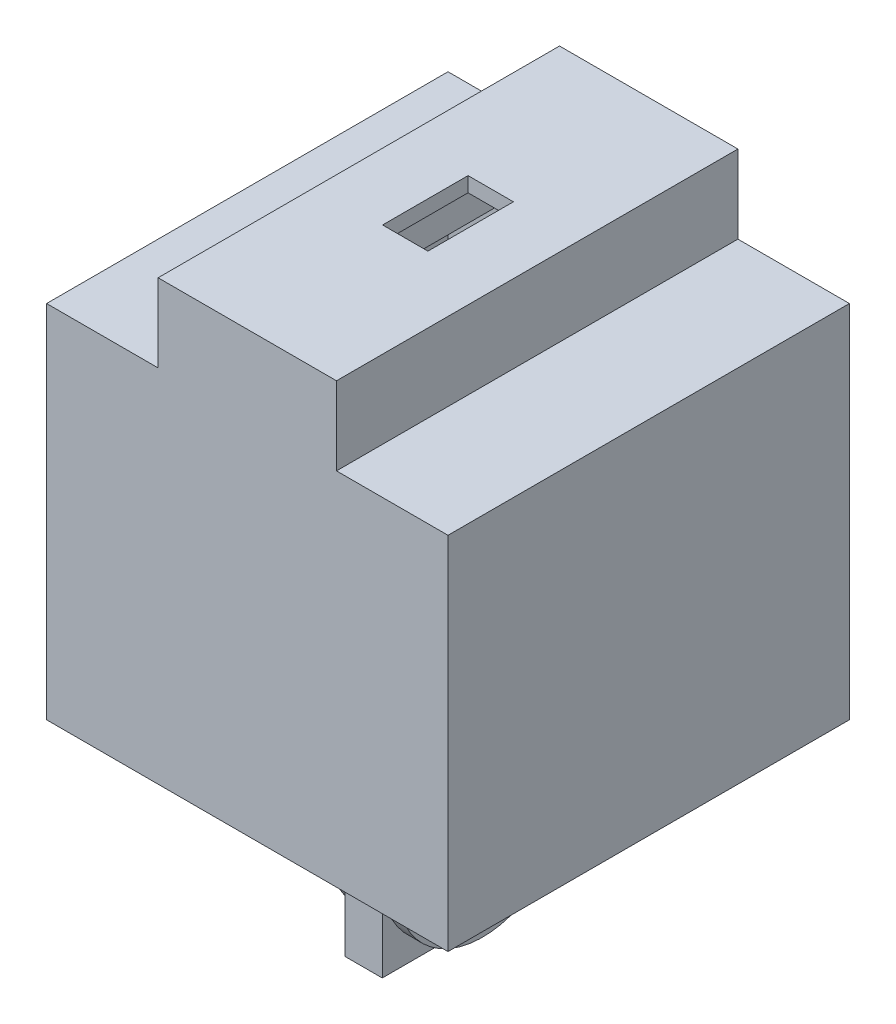
ISO-10303-21;
HEADER;
FILE_DESCRIPTION(('STEP AP214'),'2;1');
FILE_NAME('part.step','',(''),(''),'','','');
FILE_SCHEMA(('AUTOMOTIVE_DESIGN { 1 0 10303 214 1 1 1 1 }'));
ENDSEC;
DATA;
#1=APPLICATION_CONTEXT('core data for automotive mechanical design processes');
#2=APPLICATION_PROTOCOL_DEFINITION('international standard','automotive_design',2000,#1);
#3=PRODUCT_CONTEXT('',#1,'mechanical');
#4=PRODUCT('Part','Part','',(#3));
#5=PRODUCT_RELATED_PRODUCT_CATEGORY('part','',(#4));
#6=PRODUCT_DEFINITION_FORMATION('','',#4);
#7=PRODUCT_DEFINITION_CONTEXT('part definition',#1,'design');
#8=PRODUCT_DEFINITION('design','',#6,#7);
#9=PRODUCT_DEFINITION_SHAPE('','',#8);
#10=(LENGTH_UNIT() NAMED_UNIT(*) SI_UNIT(.MILLI.,.METRE.));
#11=(NAMED_UNIT(*) PLANE_ANGLE_UNIT() SI_UNIT($,.RADIAN.));
#12=(NAMED_UNIT(*) SI_UNIT($,.STERADIAN.) SOLID_ANGLE_UNIT());
#13=UNCERTAINTY_MEASURE_WITH_UNIT(LENGTH_MEASURE(1.E-05),#10,'distance_accuracy_value','');
#14=(GEOMETRIC_REPRESENTATION_CONTEXT(3) GLOBAL_UNCERTAINTY_ASSIGNED_CONTEXT((#13)) GLOBAL_UNIT_ASSIGNED_CONTEXT((#10,
#11,#12)) REPRESENTATION_CONTEXT('',''));
#15=CARTESIAN_POINT('',(0.,0.,0.));
#16=DIRECTION('',(0.,0.,1.));
#17=DIRECTION('',(1.,0.,0.));
#18=AXIS2_PLACEMENT_3D('',#15,#16,#17);
#19=CARTESIAN_POINT('',(45.3139287517532,-50.,72.9978574814878));
#20=DIRECTION('',(1.,0.,0.));
#21=DIRECTION('',(0.,0.,-1.));
#22=AXIS2_PLACEMENT_3D('',#19,#20,#21);
#23=PLANE('',#22);
#24=CARTESIAN_POINT('',(45.3139287517532,-27.,50.));
#25=DIRECTION('',(-1.,0.,0.));
#26=DIRECTION('',(0.,0.,1.));
#27=AXIS2_PLACEMENT_3D('',#24,#25,#26);
#28=CIRCLE('',#27,22.9978574814878);
#29=CARTESIAN_POINT('',(45.3139287517532,-27.,27.0021425185122));
#30=VERTEX_POINT('',#29);
#31=CARTESIAN_POINT('',(45.3139287517532,-27.,72.9978574814878));
#32=VERTEX_POINT('',#31);
#33=EDGE_CURVE('E291',#30,#32,#28,.T.);
#34=ORIENTED_EDGE('',*,*,#33,.F.);
#35=DIRECTION('',(0.,1.,0.));
#36=VECTOR('',#35,1.);
#37=CARTESIAN_POINT('',(45.3139287517532,-50.,27.0021425185122));
#38=LINE('',#37,#36);
#39=CARTESIAN_POINT('',(45.3139287517532,-50.,27.0021425185122));
#40=VERTEX_POINT('',#39);
#41=EDGE_CURVE('E272',#40,#30,#38,.T.);
#42=ORIENTED_EDGE('',*,*,#41,.F.);
#43=DIRECTION('',(0.,0.,-1.));
#44=VECTOR('',#43,1.);
#45=CARTESIAN_POINT('',(45.3139287517532,-50.,72.9978574814878));
#46=LINE('',#45,#44);
#47=CARTESIAN_POINT('',(45.3139287517532,-50.,72.9978574814878));
#48=VERTEX_POINT('',#47);
#49=EDGE_CURVE('E313',#48,#40,#46,.T.);
#50=ORIENTED_EDGE('',*,*,#49,.F.);
#51=DIRECTION('',(0.,1.,0.));
#52=VECTOR('',#51,1.);
#53=CARTESIAN_POINT('',(45.3139287517532,-50.,72.9978574814878));
#54=LINE('',#53,#52);
#55=EDGE_CURVE('E293',#48,#32,#54,.T.);
#56=ORIENTED_EDGE('',*,*,#55,.T.);
#57=EDGE_LOOP('',(#34,#42,#50,#56));
#58=FACE_BOUND('',#57,.T.);
#59=ADVANCED_FACE('F98',(#58),#23,.F.);
#60=CARTESIAN_POINT('',(55.3139287517532,-50.,72.9978574814878));
#61=DIRECTION('',(-1.,0.,0.));
#62=DIRECTION('',(0.,0.,1.));
#63=AXIS2_PLACEMENT_3D('',#60,#61,#62);
#64=PLANE('',#63);
#65=CARTESIAN_POINT('',(55.3139287517532,-27.,50.));
#66=DIRECTION('',(1.,0.,0.));
#67=DIRECTION('',(0.,0.,-1.));
#68=AXIS2_PLACEMENT_3D('',#65,#66,#67);
#69=CIRCLE('',#68,22.9978574814878);
#70=CARTESIAN_POINT('',(55.3139287517532,-27.,72.9978574814878));
#71=VERTEX_POINT('',#70);
#72=CARTESIAN_POINT('',(55.3139287517532,-27.,27.0021425185122));
#73=VERTEX_POINT('',#72);
#74=EDGE_CURVE('E299',#71,#73,#69,.T.);
#75=ORIENTED_EDGE('',*,*,#74,.F.);
#76=DIRECTION('',(0.,1.,0.));
#77=VECTOR('',#76,1.);
#78=CARTESIAN_POINT('',(55.3139287517532,-50.,72.9978574814878));
#79=LINE('',#78,#77);
#80=CARTESIAN_POINT('',(55.3139287517532,-50.,72.9978574814878));
#81=VERTEX_POINT('',#80);
#82=EDGE_CURVE('E328',#81,#71,#79,.T.);
#83=ORIENTED_EDGE('',*,*,#82,.F.);
#84=DIRECTION('',(0.,0.,1.));
#85=VECTOR('',#84,1.);
#86=CARTESIAN_POINT('',(55.3139287517532,-50.,72.9978574814878));
#87=LINE('',#86,#85);
#88=CARTESIAN_POINT('',(55.3139287517532,-50.,27.0021425185122));
#89=VERTEX_POINT('',#88);
#90=EDGE_CURVE('E307',#89,#81,#87,.T.);
#91=ORIENTED_EDGE('',*,*,#90,.F.);
#92=DIRECTION('',(0.,1.,0.));
#93=VECTOR('',#92,1.);
#94=CARTESIAN_POINT('',(55.3139287517532,-50.,27.0021425185122));
#95=LINE('',#94,#93);
#96=EDGE_CURVE('E288',#89,#73,#95,.T.);
#97=ORIENTED_EDGE('',*,*,#96,.T.);
#98=EDGE_LOOP('',(#75,#83,#91,#97));
#99=FACE_BOUND('',#98,.T.);
#100=ADVANCED_FACE('F538',(#99),#64,.F.);
#101=CARTESIAN_POINT('',(104.,-4.,100.));
#102=DIRECTION('',(0.,1.,0.));
#103=DIRECTION('',(0.,0.,1.));
#104=AXIS2_PLACEMENT_3D('',#101,#102,#103);
#105=PLANE('',#104);
#106=DIRECTION('',(0.,0.,-1.));
#107=VECTOR('',#106,1.);
#108=CARTESIAN_POINT('',(-4.,-4.,100.));
#109=LINE('',#108,#107);
#110=CARTESIAN_POINT('',(-4.,-4.,104.));
#111=VERTEX_POINT('',#110);
#112=CARTESIAN_POINT('',(-4.,-4.,-4.));
#113=VERTEX_POINT('',#112);
#114=EDGE_CURVE('E106',#111,#113,#109,.T.);
#115=ORIENTED_EDGE('',*,*,#114,.T.);
#116=DIRECTION('',(1.,0.,0.));
#117=VECTOR('',#116,1.);
#118=CARTESIAN_POINT('',(-4.,-4.,-4.));
#119=LINE('',#118,#117);
#120=CARTESIAN_POINT('',(104.,-4.,-4.));
#121=VERTEX_POINT('',#120);
#122=EDGE_CURVE('E368',#113,#121,#119,.T.);
#123=ORIENTED_EDGE('',*,*,#122,.T.);
#124=DIRECTION('',(0.,0.,-1.));
#125=VECTOR('',#124,1.);
#126=CARTESIAN_POINT('',(104.,-4.,100.));
#127=LINE('',#126,#125);
#128=CARTESIAN_POINT('',(104.,-4.,104.));
#129=VERTEX_POINT('',#128);
#130=EDGE_CURVE('E12',#129,#121,#127,.T.);
#131=ORIENTED_EDGE('',*,*,#130,.F.);
#132=DIRECTION('',(1.,0.,0.));
#133=VECTOR('',#132,1.);
#134=CARTESIAN_POINT('',(-4.,-4.,104.));
#135=LINE('',#134,#133);
#136=EDGE_CURVE('E392',#111,#129,#135,.T.);
#137=ORIENTED_EDGE('',*,*,#136,.F.);
#138=EDGE_LOOP('',(#115,#123,#131,#137));
#139=FACE_BOUND('',#138,.T.);
#140=DIRECTION('',(0.,0.,1.));
#141=VECTOR('',#140,1.);
#142=CARTESIAN_POINT('',(55.3139287517532,-4.,72.9978574814878));
#143=LINE('',#142,#141);
#144=CARTESIAN_POINT('',(55.3139287517532,-4.,27.0021425185122));
#145=VERTEX_POINT('',#144);
#146=CARTESIAN_POINT('',(55.3139287517532,-4.,72.9978574814878));
#147=VERTEX_POINT('',#146);
#148=EDGE_CURVE('E305',#145,#147,#143,.T.);
#149=ORIENTED_EDGE('',*,*,#148,.F.);
#150=DIRECTION('',(1.,0.,0.));
#151=VECTOR('',#150,1.);
#152=CARTESIAN_POINT('',(45.3139287517532,-4.,27.0021425185122));
#153=LINE('',#152,#151);
#154=CARTESIAN_POINT('',(45.3139287517532,-4.,27.0021425185122));
#155=VERTEX_POINT('',#154);
#156=EDGE_CURVE('E311',#155,#145,#153,.T.);
#157=ORIENTED_EDGE('',*,*,#156,.F.);
#158=DIRECTION('',(0.,0.,-1.));
#159=VECTOR('',#158,1.);
#160=CARTESIAN_POINT('',(45.3139287517532,-4.,72.9978574814878));
#161=LINE('',#160,#159);
#162=CARTESIAN_POINT('',(45.3139287517532,-4.,72.9978574814878));
#163=VERTEX_POINT('',#162);
#164=EDGE_CURVE('E287',#163,#155,#161,.T.);
#165=ORIENTED_EDGE('',*,*,#164,.F.);
#166=DIRECTION('',(-1.,0.,0.));
#167=VECTOR('',#166,1.);
#168=CARTESIAN_POINT('',(45.3139287517532,-4.,72.9978574814878));
#169=LINE('',#168,#167);
#170=EDGE_CURVE('E319',#147,#163,#169,.T.);
#171=ORIENTED_EDGE('',*,*,#170,.F.);
#172=EDGE_LOOP('',(#149,#157,#165,#171));
#173=FACE_BOUND('',#172,.T.);
#174=ADVANCED_FACE('F100',(#139,#173),#105,.F.);
#175=CARTESIAN_POINT('',(104.,114.,100.));
#176=DIRECTION('',(-1.,0.,0.));
#177=DIRECTION('',(0.,0.,1.));
#178=AXIS2_PLACEMENT_3D('',#175,#176,#177);
#179=PLANE('',#178);
#180=DIRECTION('',(0.,0.,1.));
#181=VECTOR('',#180,1.);
#182=CARTESIAN_POINT('',(104.,93.,0.));
#183=LINE('',#182,#181);
#184=CARTESIAN_POINT('',(104.,93.,-4.));
#185=VERTEX_POINT('',#184);
#186=CARTESIAN_POINT('',(104.,93.,104.));
#187=VERTEX_POINT('',#186);
#188=EDGE_CURVE('E411',#185,#187,#183,.T.);
#189=ORIENTED_EDGE('',*,*,#188,.T.);
#190=DIRECTION('',(0.,1.,0.));
#191=VECTOR('',#190,1.);
#192=CARTESIAN_POINT('',(104.,-4.,104.));
#193=LINE('',#192,#191);
#194=EDGE_CURVE('E395',#129,#187,#193,.T.);
#195=ORIENTED_EDGE('',*,*,#194,.F.);
#196=ORIENTED_EDGE('',*,*,#130,.T.);
#197=DIRECTION('',(0.,1.,0.));
#198=VECTOR('',#197,1.);
#199=CARTESIAN_POINT('',(104.,-4.,-4.));
#200=LINE('',#199,#198);
#201=EDGE_CURVE('E371',#121,#185,#200,.T.);
#202=ORIENTED_EDGE('',*,*,#201,.T.);
#203=EDGE_LOOP('',(#189,#195,#196,#202));
#204=FACE_BOUND('',#203,.T.);
#205=ADVANCED_FACE('F520',(#204),#179,.F.);
#206=CARTESIAN_POINT('',(-4.,114.,100.));
#207=DIRECTION('',(0.,-1.,0.));
#208=DIRECTION('',(0.,0.,-1.));
#209=AXIS2_PLACEMENT_3D('',#206,#207,#208);
#210=PLANE('',#209);
#211=DIRECTION('',(0.,0.,1.));
#212=VECTOR('',#211,1.);
#213=CARTESIAN_POINT('',(43.9,114.,0.));
#214=LINE('',#213,#212);
#215=CARTESIAN_POINT('',(43.9,114.,38.5));
#216=VERTEX_POINT('',#215);
#217=CARTESIAN_POINT('',(43.9,114.,61.5));
#218=VERTEX_POINT('',#217);
#219=EDGE_CURVE('E346',#216,#218,#214,.T.);
#220=ORIENTED_EDGE('',*,*,#219,.F.);
#221=DIRECTION('',(-1.,0.,0.));
#222=VECTOR('',#221,1.);
#223=CARTESIAN_POINT('',(0.,114.,38.5));
#224=LINE('',#223,#222);
#225=CARTESIAN_POINT('',(56.1,114.,38.5));
#226=VERTEX_POINT('',#225);
#227=EDGE_CURVE('E330',#226,#216,#224,.T.);
#228=ORIENTED_EDGE('',*,*,#227,.F.);
#229=DIRECTION('',(0.,0.,-1.));
#230=VECTOR('',#229,1.);
#231=CARTESIAN_POINT('',(56.1,114.,0.));
#232=LINE('',#231,#230);
#233=CARTESIAN_POINT('',(56.1,114.,61.5));
#234=VERTEX_POINT('',#233);
#235=EDGE_CURVE('E335',#234,#226,#232,.T.);
#236=ORIENTED_EDGE('',*,*,#235,.F.);
#237=DIRECTION('',(1.,0.,0.));
#238=VECTOR('',#237,1.);
#239=CARTESIAN_POINT('',(0.,114.,61.5));
#240=LINE('',#239,#238);
#241=EDGE_CURVE('E349',#218,#234,#240,.T.);
#242=ORIENTED_EDGE('',*,*,#241,.F.);
#243=EDGE_LOOP('',(#220,#228,#236,#242));
#244=FACE_BOUND('',#243,.T.);
#245=DIRECTION('',(0.,0.,1.));
#246=VECTOR('',#245,1.);
#247=CARTESIAN_POINT('',(74.,114.,0.));
#248=LINE('',#247,#246);
#249=CARTESIAN_POINT('',(74.,114.,-4.));
#250=VERTEX_POINT('',#249);
#251=CARTESIAN_POINT('',(74.,114.,104.));
#252=VERTEX_POINT('',#251);
#253=EDGE_CURVE('E410',#250,#252,#248,.T.);
#254=ORIENTED_EDGE('',*,*,#253,.F.);
#255=DIRECTION('',(-1.,0.,0.));
#256=VECTOR('',#255,1.);
#257=CARTESIAN_POINT('',(74.,114.,-4.));
#258=LINE('',#257,#256);
#259=CARTESIAN_POINT('',(26.,114.,-4.));
#260=VERTEX_POINT('',#259);
#261=EDGE_CURVE('E380',#250,#260,#258,.T.);
#262=ORIENTED_EDGE('',*,*,#261,.T.);
#263=DIRECTION('',(0.,0.,1.));
#264=VECTOR('',#263,1.);
#265=CARTESIAN_POINT('',(26.,114.,0.));
#266=LINE('',#265,#264);
#267=CARTESIAN_POINT('',(26.,114.,104.));
#268=VERTEX_POINT('',#267);
#269=EDGE_CURVE('E461',#260,#268,#266,.T.);
#270=ORIENTED_EDGE('',*,*,#269,.T.);
#271=DIRECTION('',(-1.,0.,0.));
#272=VECTOR('',#271,1.);
#273=CARTESIAN_POINT('',(74.,114.,104.));
#274=LINE('',#273,#272);
#275=EDGE_CURVE('E404',#252,#268,#274,.T.);
#276=ORIENTED_EDGE('',*,*,#275,.F.);
#277=EDGE_LOOP('',(#254,#262,#270,#276));
#278=FACE_BOUND('',#277,.T.);
#279=ADVANCED_FACE('F513',(#244,#278),#210,.F.);
#280=CARTESIAN_POINT('',(-4.,-4.,100.));
#281=DIRECTION('',(1.,0.,0.));
#282=DIRECTION('',(0.,0.,-1.));
#283=AXIS2_PLACEMENT_3D('',#280,#281,#282);
#284=PLANE('',#283);
#285=ORIENTED_EDGE('',*,*,#114,.F.);
#286=DIRECTION('',(0.,-1.,0.));
#287=VECTOR('',#286,1.);
#288=CARTESIAN_POINT('',(-4.,93.,104.));
#289=LINE('',#288,#287);
#290=CARTESIAN_POINT('',(-4.,93.,104.));
#291=VERTEX_POINT('',#290);
#292=EDGE_CURVE('E389',#291,#111,#289,.T.);
#293=ORIENTED_EDGE('',*,*,#292,.F.);
#294=DIRECTION('',(0.,0.,1.));
#295=VECTOR('',#294,1.);
#296=CARTESIAN_POINT('',(-4.,93.,0.));
#297=LINE('',#296,#295);
#298=CARTESIAN_POINT('',(-4.,93.,-4.));
#299=VERTEX_POINT('',#298);
#300=EDGE_CURVE('E459',#299,#291,#297,.T.);
#301=ORIENTED_EDGE('',*,*,#300,.F.);
#302=DIRECTION('',(0.,-1.,0.));
#303=VECTOR('',#302,1.);
#304=CARTESIAN_POINT('',(-4.,93.,-4.));
#305=LINE('',#304,#303);
#306=EDGE_CURVE('E365',#299,#113,#305,.T.);
#307=ORIENTED_EDGE('',*,*,#306,.T.);
#308=EDGE_LOOP('',(#285,#293,#301,#307));
#309=FACE_BOUND('',#308,.T.);
#310=ADVANCED_FACE('F504',(#309),#284,.F.);
#311=CARTESIAN_POINT('',(-4.,93.,0.));
#312=DIRECTION('',(0.,-1.,0.));
#313=DIRECTION('',(0.,0.,-1.));
#314=AXIS2_PLACEMENT_3D('',#311,#312,#313);
#315=PLANE('',#314);
#316=ORIENTED_EDGE('',*,*,#300,.T.);
#317=DIRECTION('',(-1.,0.,0.));
#318=VECTOR('',#317,1.);
#319=CARTESIAN_POINT('',(0.,93.,104.));
#320=LINE('',#319,#318);
#321=CARTESIAN_POINT('',(26.,93.,104.));
#322=VERTEX_POINT('',#321);
#323=EDGE_CURVE('E386',#322,#291,#320,.T.);
#324=ORIENTED_EDGE('',*,*,#323,.F.);
#325=DIRECTION('',(0.,0.,1.));
#326=VECTOR('',#325,1.);
#327=CARTESIAN_POINT('',(26.,93.,0.));
#328=LINE('',#327,#326);
#329=CARTESIAN_POINT('',(26.,93.,-4.));
#330=VERTEX_POINT('',#329);
#331=EDGE_CURVE('E457',#330,#322,#328,.T.);
#332=ORIENTED_EDGE('',*,*,#331,.F.);
#333=DIRECTION('',(-1.,0.,0.));
#334=VECTOR('',#333,1.);
#335=CARTESIAN_POINT('',(0.,93.,-4.));
#336=LINE('',#335,#334);
#337=EDGE_CURVE('E356',#330,#299,#336,.T.);
#338=ORIENTED_EDGE('',*,*,#337,.T.);
#339=EDGE_LOOP('',(#316,#324,#332,#338));
#340=FACE_BOUND('',#339,.T.);
#341=ADVANCED_FACE('F507',(#340),#315,.F.);
#342=CARTESIAN_POINT('',(26.,93.,0.));
#343=DIRECTION('',(1.,0.,0.));
#344=DIRECTION('',(0.,1.,0.));
#345=AXIS2_PLACEMENT_3D('',#342,#343,#344);
#346=PLANE('',#345);
#347=ORIENTED_EDGE('',*,*,#269,.F.);
#348=DIRECTION('',(0.,-1.,0.));
#349=VECTOR('',#348,1.);
#350=CARTESIAN_POINT('',(26.,114.,-4.));
#351=LINE('',#350,#349);
#352=EDGE_CURVE('E383',#260,#330,#351,.T.);
#353=ORIENTED_EDGE('',*,*,#352,.T.);
#354=ORIENTED_EDGE('',*,*,#331,.T.);
#355=DIRECTION('',(0.,-1.,0.));
#356=VECTOR('',#355,1.);
#357=CARTESIAN_POINT('',(26.,114.,104.));
#358=LINE('',#357,#356);
#359=EDGE_CURVE('E407',#268,#322,#358,.T.);
#360=ORIENTED_EDGE('',*,*,#359,.F.);
#361=EDGE_LOOP('',(#347,#353,#354,#360));
#362=FACE_BOUND('',#361,.T.);
#363=ADVANCED_FACE('F526',(#362),#346,.F.);
#364=CARTESIAN_POINT('',(74.,110.,0.));
#365=DIRECTION('',(1.,0.,0.));
#366=DIRECTION('',(0.,0.,-1.));
#367=AXIS2_PLACEMENT_3D('',#364,#365,#366);
#368=PLANE('',#367);
#369=DIRECTION('',(0.,0.,1.));
#370=VECTOR('',#369,1.);
#371=CARTESIAN_POINT('',(74.,93.,0.));
#372=LINE('',#371,#370);
#373=CARTESIAN_POINT('',(74.,93.,-4.));
#374=VERTEX_POINT('',#373);
#375=CARTESIAN_POINT('',(74.,93.,104.));
#376=VERTEX_POINT('',#375);
#377=EDGE_CURVE('E442',#374,#376,#372,.T.);
#378=ORIENTED_EDGE('',*,*,#377,.F.);
#379=DIRECTION('',(0.,1.,0.));
#380=VECTOR('',#379,1.);
#381=CARTESIAN_POINT('',(74.,93.,-4.));
#382=LINE('',#381,#380);
#383=EDGE_CURVE('E377',#374,#250,#382,.T.);
#384=ORIENTED_EDGE('',*,*,#383,.T.);
#385=ORIENTED_EDGE('',*,*,#253,.T.);
#386=DIRECTION('',(0.,1.,0.));
#387=VECTOR('',#386,1.);
#388=CARTESIAN_POINT('',(74.,93.,104.));
#389=LINE('',#388,#387);
#390=EDGE_CURVE('E401',#376,#252,#389,.T.);
#391=ORIENTED_EDGE('',*,*,#390,.F.);
#392=EDGE_LOOP('',(#378,#384,#385,#391));
#393=FACE_BOUND('',#392,.T.);
#394=ADVANCED_FACE('F517',(#393),#368,.T.);
#395=CARTESIAN_POINT('',(100.,93.,0.));
#396=DIRECTION('',(0.,1.,0.));
#397=DIRECTION('',(0.,0.,1.));
#398=AXIS2_PLACEMENT_3D('',#395,#396,#397);
#399=PLANE('',#398);
#400=ORIENTED_EDGE('',*,*,#377,.T.);
#401=DIRECTION('',(-1.,0.,0.));
#402=VECTOR('',#401,1.);
#403=CARTESIAN_POINT('',(100.,93.,104.));
#404=LINE('',#403,#402);
#405=EDGE_CURVE('E398',#187,#376,#404,.T.);
#406=ORIENTED_EDGE('',*,*,#405,.F.);
#407=ORIENTED_EDGE('',*,*,#188,.F.);
#408=DIRECTION('',(-1.,0.,0.));
#409=VECTOR('',#408,1.);
#410=CARTESIAN_POINT('',(100.,93.,-4.));
#411=LINE('',#410,#409);
#412=EDGE_CURVE('E374',#185,#374,#411,.T.);
#413=ORIENTED_EDGE('',*,*,#412,.T.);
#414=EDGE_LOOP('',(#400,#406,#407,#413));
#415=FACE_BOUND('',#414,.T.);
#416=ADVANCED_FACE('F533',(#415),#399,.T.);
#417=CARTESIAN_POINT('',(0.,0.,104.));
#418=DIRECTION('',(0.,0.,1.));
#419=DIRECTION('',(1.,0.,0.));
#420=AXIS2_PLACEMENT_3D('',#417,#418,#419);
#421=PLANE('',#420);
#422=ORIENTED_EDGE('',*,*,#323,.T.);
#423=ORIENTED_EDGE('',*,*,#292,.T.);
#424=ORIENTED_EDGE('',*,*,#136,.T.);
#425=ORIENTED_EDGE('',*,*,#194,.T.);
#426=ORIENTED_EDGE('',*,*,#405,.T.);
#427=ORIENTED_EDGE('',*,*,#390,.T.);
#428=ORIENTED_EDGE('',*,*,#275,.T.);
#429=ORIENTED_EDGE('',*,*,#359,.T.);
#430=EDGE_LOOP('',(#422,#423,#424,#425,#426,#427,#428,#429));
#431=FACE_BOUND('',#430,.T.);
#432=ADVANCED_FACE('F523',(#431),#421,.T.);
#433=CARTESIAN_POINT('',(0.,0.,-4.));
#434=DIRECTION('',(0.,0.,1.));
#435=DIRECTION('',(1.,0.,0.));
#436=AXIS2_PLACEMENT_3D('',#433,#434,#435);
#437=PLANE('',#436);
#438=ORIENTED_EDGE('',*,*,#337,.F.);
#439=ORIENTED_EDGE('',*,*,#352,.F.);
#440=ORIENTED_EDGE('',*,*,#261,.F.);
#441=ORIENTED_EDGE('',*,*,#383,.F.);
#442=ORIENTED_EDGE('',*,*,#412,.F.);
#443=ORIENTED_EDGE('',*,*,#201,.F.);
#444=ORIENTED_EDGE('',*,*,#122,.F.);
#445=ORIENTED_EDGE('',*,*,#306,.F.);
#446=EDGE_LOOP('',(#438,#439,#440,#441,#442,#443,#444,#445));
#447=FACE_BOUND('',#446,.T.);
#448=ADVANCED_FACE('F502',(#447),#437,.F.);
#449=CARTESIAN_POINT('',(0.,110.,38.5));
#450=DIRECTION('',(0.,0.,-1.));
#451=DIRECTION('',(-1.,0.,0.));
#452=AXIS2_PLACEMENT_3D('',#449,#450,#451);
#453=PLANE('',#452);
#454=ORIENTED_EDGE('',*,*,#227,.T.);
#455=DIRECTION('',(0.,1.,0.));
#456=VECTOR('',#455,1.);
#457=CARTESIAN_POINT('',(43.9,110.,38.5));
#458=LINE('',#457,#456);
#459=CARTESIAN_POINT('',(43.9,110.,38.5));
#460=VERTEX_POINT('',#459);
#461=EDGE_CURVE('E344',#460,#216,#458,.T.);
#462=ORIENTED_EDGE('',*,*,#461,.F.);
#463=DIRECTION('',(-1.,0.,0.));
#464=VECTOR('',#463,1.);
#465=CARTESIAN_POINT('',(0.,110.,38.5));
#466=LINE('',#465,#464);
#467=CARTESIAN_POINT('',(56.1,110.,38.5));
#468=VERTEX_POINT('',#467);
#469=EDGE_CURVE('E331',#468,#460,#466,.T.);
#470=ORIENTED_EDGE('',*,*,#469,.F.);
#471=DIRECTION('',(0.,1.,0.));
#472=VECTOR('',#471,1.);
#473=CARTESIAN_POINT('',(56.1,110.,38.5));
#474=LINE('',#473,#472);
#475=EDGE_CURVE('E354',#468,#226,#474,.T.);
#476=ORIENTED_EDGE('',*,*,#475,.T.);
#477=EDGE_LOOP('',(#454,#462,#470,#476));
#478=FACE_BOUND('',#477,.T.);
#479=ADVANCED_FACE('F565',(#478),#453,.F.);
#480=CARTESIAN_POINT('',(56.1,110.,0.));
#481=DIRECTION('',(1.,0.,0.));
#482=DIRECTION('',(0.,0.,-1.));
#483=AXIS2_PLACEMENT_3D('',#480,#481,#482);
#484=PLANE('',#483);
#485=ORIENTED_EDGE('',*,*,#235,.T.);
#486=ORIENTED_EDGE('',*,*,#475,.F.);
#487=DIRECTION('',(0.,0.,-1.));
#488=VECTOR('',#487,1.);
#489=CARTESIAN_POINT('',(56.1,110.,0.));
#490=LINE('',#489,#488);
#491=CARTESIAN_POINT('',(56.1,110.,61.5));
#492=VERTEX_POINT('',#491);
#493=EDGE_CURVE('E341',#492,#468,#490,.T.);
#494=ORIENTED_EDGE('',*,*,#493,.F.);
#495=DIRECTION('',(0.,1.,0.));
#496=VECTOR('',#495,1.);
#497=CARTESIAN_POINT('',(56.1,110.,61.5));
#498=LINE('',#497,#496);
#499=EDGE_CURVE('E357',#492,#234,#498,.T.);
#500=ORIENTED_EDGE('',*,*,#499,.T.);
#501=EDGE_LOOP('',(#485,#486,#494,#500));
#502=FACE_BOUND('',#501,.T.);
#503=ADVANCED_FACE('F561',(#502),#484,.F.);
#504=CARTESIAN_POINT('',(0.,110.,61.5));
#505=DIRECTION('',(0.,0.,1.));
#506=DIRECTION('',(1.,0.,0.));
#507=AXIS2_PLACEMENT_3D('',#504,#505,#506);
#508=PLANE('',#507);
#509=ORIENTED_EDGE('',*,*,#241,.T.);
#510=ORIENTED_EDGE('',*,*,#499,.F.);
#511=DIRECTION('',(1.,0.,0.));
#512=VECTOR('',#511,1.);
#513=CARTESIAN_POINT('',(0.,110.,61.5));
#514=LINE('',#513,#512);
#515=CARTESIAN_POINT('',(43.9,110.,61.5));
#516=VERTEX_POINT('',#515);
#517=EDGE_CURVE('E338',#516,#492,#514,.T.);
#518=ORIENTED_EDGE('',*,*,#517,.F.);
#519=DIRECTION('',(0.,1.,0.));
#520=VECTOR('',#519,1.);
#521=CARTESIAN_POINT('',(43.9,110.,61.5));
#522=LINE('',#521,#520);
#523=EDGE_CURVE('E359',#516,#218,#522,.T.);
#524=ORIENTED_EDGE('',*,*,#523,.T.);
#525=EDGE_LOOP('',(#509,#510,#518,#524));
#526=FACE_BOUND('',#525,.T.);
#527=ADVANCED_FACE('F564',(#526),#508,.F.);
#528=CARTESIAN_POINT('',(43.9,110.,0.));
#529=DIRECTION('',(-1.,0.,0.));
#530=DIRECTION('',(0.,0.,1.));
#531=AXIS2_PLACEMENT_3D('',#528,#529,#530);
#532=PLANE('',#531);
#533=ORIENTED_EDGE('',*,*,#219,.T.);
#534=ORIENTED_EDGE('',*,*,#523,.F.);
#535=DIRECTION('',(0.,0.,1.));
#536=VECTOR('',#535,1.);
#537=CARTESIAN_POINT('',(43.9,110.,0.));
#538=LINE('',#537,#536);
#539=EDGE_CURVE('E334',#460,#516,#538,.T.);
#540=ORIENTED_EDGE('',*,*,#539,.F.);
#541=ORIENTED_EDGE('',*,*,#461,.T.);
#542=EDGE_LOOP('',(#533,#534,#540,#541));
#543=FACE_BOUND('',#542,.T.);
#544=ADVANCED_FACE('F569',(#543),#532,.F.);
#545=CARTESIAN_POINT('',(0.,110.,100.));
#546=DIRECTION('',(0.,-1.,0.));
#547=DIRECTION('',(0.,0.,-1.));
#548=AXIS2_PLACEMENT_3D('',#545,#546,#547);
#549=PLANE('',#548);
#550=DIRECTION('',(-1.,0.,0.));
#551=VECTOR('',#550,1.);
#552=CARTESIAN_POINT('',(0.,110.,100.));
#553=LINE('',#552,#551);
#554=CARTESIAN_POINT('',(70.,110.,100.));
#555=VERTEX_POINT('',#554);
#556=CARTESIAN_POINT('',(30.,110.,100.));
#557=VERTEX_POINT('',#556);
#558=EDGE_CURVE('E472',#555,#557,#553,.T.);
#559=ORIENTED_EDGE('',*,*,#558,.T.);
#560=DIRECTION('',(0.,0.,1.));
#561=VECTOR('',#560,1.);
#562=CARTESIAN_POINT('',(30.,110.,0.));
#563=LINE('',#562,#561);
#564=CARTESIAN_POINT('',(30.,110.,0.));
#565=VERTEX_POINT('',#564);
#566=EDGE_CURVE('E446',#565,#557,#563,.T.);
#567=ORIENTED_EDGE('',*,*,#566,.F.);
#568=DIRECTION('',(-1.,0.,0.));
#569=VECTOR('',#568,1.);
#570=CARTESIAN_POINT('',(0.,110.,0.));
#571=LINE('',#570,#569);
#572=CARTESIAN_POINT('',(70.,110.,0.));
#573=VERTEX_POINT('',#572);
#574=EDGE_CURVE('E484',#573,#565,#571,.T.);
#575=ORIENTED_EDGE('',*,*,#574,.F.);
#576=DIRECTION('',(0.,0.,1.));
#577=VECTOR('',#576,1.);
#578=CARTESIAN_POINT('',(70.,110.,0.));
#579=LINE('',#578,#577);
#580=EDGE_CURVE('E449',#573,#555,#579,.T.);
#581=ORIENTED_EDGE('',*,*,#580,.T.);
#582=EDGE_LOOP('',(#559,#567,#575,#581));
#583=FACE_BOUND('',#582,.T.);
#584=ORIENTED_EDGE('',*,*,#493,.T.);
#585=ORIENTED_EDGE('',*,*,#469,.T.);
#586=ORIENTED_EDGE('',*,*,#539,.T.);
#587=ORIENTED_EDGE('',*,*,#517,.T.);
#588=EDGE_LOOP('',(#584,#585,#586,#587));
#589=FACE_BOUND('',#588,.T.);
#590=ADVANCED_FACE('F573',(#583,#589),#549,.T.);
#591=CARTESIAN_POINT('',(0.,0.,0.));
#592=DIRECTION('',(0.,0.,1.));
#593=DIRECTION('',(1.,0.,0.));
#594=AXIS2_PLACEMENT_3D('',#591,#592,#593);
#595=PLANE('',#594);
#596=DIRECTION('',(1.,0.,0.));
#597=VECTOR('',#596,1.);
#598=CARTESIAN_POINT('',(100.,0.,0.));
#599=LINE('',#598,#597);
#600=CARTESIAN_POINT('',(0.,0.,0.));
#601=VERTEX_POINT('',#600);
#602=CARTESIAN_POINT('',(100.,0.,0.));
#603=VERTEX_POINT('',#602);
#604=EDGE_CURVE('E463',#601,#603,#599,.T.);
#605=ORIENTED_EDGE('',*,*,#604,.T.);
#606=DIRECTION('',(0.,1.,0.));
#607=VECTOR('',#606,1.);
#608=CARTESIAN_POINT('',(100.,110.,0.));
#609=LINE('',#608,#607);
#610=CARTESIAN_POINT('',(100.,89.,0.));
#611=VERTEX_POINT('',#610);
#612=EDGE_CURVE('E481',#603,#611,#609,.T.);
#613=ORIENTED_EDGE('',*,*,#612,.T.);
#614=DIRECTION('',(-1.,0.,0.));
#615=VECTOR('',#614,1.);
#616=CARTESIAN_POINT('',(100.,89.,0.));
#617=LINE('',#616,#615);
#618=CARTESIAN_POINT('',(70.,89.,0.));
#619=VERTEX_POINT('',#618);
#620=EDGE_CURVE('E415',#611,#619,#617,.T.);
#621=ORIENTED_EDGE('',*,*,#620,.T.);
#622=DIRECTION('',(0.,1.,0.));
#623=VECTOR('',#622,1.);
#624=CARTESIAN_POINT('',(70.,93.,0.));
#625=LINE('',#624,#623);
#626=EDGE_CURVE('E418',#619,#573,#625,.T.);
#627=ORIENTED_EDGE('',*,*,#626,.T.);
#628=ORIENTED_EDGE('',*,*,#574,.T.);
#629=DIRECTION('',(0.,-1.,0.));
#630=VECTOR('',#629,1.);
#631=CARTESIAN_POINT('',(30.,93.,0.));
#632=LINE('',#631,#630);
#633=CARTESIAN_POINT('',(30.,89.,0.));
#634=VERTEX_POINT('',#633);
#635=EDGE_CURVE('E422',#565,#634,#632,.T.);
#636=ORIENTED_EDGE('',*,*,#635,.T.);
#637=DIRECTION('',(-1.,0.,0.));
#638=VECTOR('',#637,1.);
#639=CARTESIAN_POINT('',(0.,89.,0.));
#640=LINE('',#639,#638);
#641=CARTESIAN_POINT('',(0.,89.,0.));
#642=VERTEX_POINT('',#641);
#643=EDGE_CURVE('E425',#634,#642,#640,.T.);
#644=ORIENTED_EDGE('',*,*,#643,.T.);
#645=DIRECTION('',(0.,-1.,0.));
#646=VECTOR('',#645,1.);
#647=CARTESIAN_POINT('',(0.,0.,0.));
#648=LINE('',#647,#646);
#649=EDGE_CURVE('E469',#642,#601,#648,.T.);
#650=ORIENTED_EDGE('',*,*,#649,.T.);
#651=EDGE_LOOP('',(#605,#613,#621,#627,#628,#636,#644,#650));
#652=FACE_BOUND('',#651,.T.);
#653=ADVANCED_FACE('F580',(#652),#595,.T.);
#654=CARTESIAN_POINT('',(0.,0.,100.));
#655=DIRECTION('',(0.,0.,1.));
#656=DIRECTION('',(1.,0.,0.));
#657=AXIS2_PLACEMENT_3D('',#654,#655,#656);
#658=PLANE('',#657);
#659=DIRECTION('',(-1.,0.,0.));
#660=VECTOR('',#659,1.);
#661=CARTESIAN_POINT('',(100.,89.,100.));
#662=LINE('',#661,#660);
#663=CARTESIAN_POINT('',(100.,89.,100.));
#664=VERTEX_POINT('',#663);
#665=CARTESIAN_POINT('',(70.,89.,100.));
#666=VERTEX_POINT('',#665);
#667=EDGE_CURVE('E413',#664,#666,#662,.T.);
#668=ORIENTED_EDGE('',*,*,#667,.F.);
#669=DIRECTION('',(0.,1.,0.));
#670=VECTOR('',#669,1.);
#671=CARTESIAN_POINT('',(100.,110.,100.));
#672=LINE('',#671,#670);
#673=CARTESIAN_POINT('',(100.,0.,100.));
#674=VERTEX_POINT('',#673);
#675=EDGE_CURVE('E468',#674,#664,#672,.T.);
#676=ORIENTED_EDGE('',*,*,#675,.F.);
#677=DIRECTION('',(1.,0.,0.));
#678=VECTOR('',#677,1.);
#679=CARTESIAN_POINT('',(100.,0.,100.));
#680=LINE('',#679,#678);
#681=CARTESIAN_POINT('',(0.,0.,100.));
#682=VERTEX_POINT('',#681);
#683=EDGE_CURVE('E465',#682,#674,#680,.T.);
#684=ORIENTED_EDGE('',*,*,#683,.F.);
#685=DIRECTION('',(0.,-1.,0.));
#686=VECTOR('',#685,1.);
#687=CARTESIAN_POINT('',(0.,0.,100.));
#688=LINE('',#687,#686);
#689=CARTESIAN_POINT('',(0.,89.,100.));
#690=VERTEX_POINT('',#689);
#691=EDGE_CURVE('E475',#690,#682,#688,.T.);
#692=ORIENTED_EDGE('',*,*,#691,.F.);
#693=DIRECTION('',(-1.,0.,0.));
#694=VECTOR('',#693,1.);
#695=CARTESIAN_POINT('',(0.,89.,100.));
#696=LINE('',#695,#694);
#697=CARTESIAN_POINT('',(30.,89.,100.));
#698=VERTEX_POINT('',#697);
#699=EDGE_CURVE('E419',#698,#690,#696,.T.);
#700=ORIENTED_EDGE('',*,*,#699,.F.);
#701=DIRECTION('',(0.,-1.,0.));
#702=VECTOR('',#701,1.);
#703=CARTESIAN_POINT('',(30.,93.,100.));
#704=LINE('',#703,#702);
#705=EDGE_CURVE('E434',#557,#698,#704,.T.);
#706=ORIENTED_EDGE('',*,*,#705,.F.);
#707=ORIENTED_EDGE('',*,*,#558,.F.);
#708=DIRECTION('',(0.,1.,0.));
#709=VECTOR('',#708,1.);
#710=CARTESIAN_POINT('',(70.,93.,100.));
#711=LINE('',#710,#709);
#712=EDGE_CURVE('E431',#666,#555,#711,.T.);
#713=ORIENTED_EDGE('',*,*,#712,.F.);
#714=EDGE_LOOP('',(#668,#676,#684,#692,#700,#706,#707,#713));
#715=FACE_BOUND('',#714,.T.);
#716=ADVANCED_FACE('F583',(#715),#658,.F.);
#717=CARTESIAN_POINT('',(100.,0.,100.));
#718=DIRECTION('',(0.,1.,0.));
#719=DIRECTION('',(0.,0.,1.));
#720=AXIS2_PLACEMENT_3D('',#717,#718,#719);
#721=PLANE('',#720);
#722=ORIENTED_EDGE('',*,*,#604,.F.);
#723=DIRECTION('',(0.,0.,-1.));
#724=VECTOR('',#723,1.);
#725=CARTESIAN_POINT('',(0.,0.,100.));
#726=LINE('',#725,#724);
#727=EDGE_CURVE('E478',#682,#601,#726,.T.);
#728=ORIENTED_EDGE('',*,*,#727,.F.);
#729=ORIENTED_EDGE('',*,*,#683,.T.);
#730=DIRECTION('',(0.,0.,-1.));
#731=VECTOR('',#730,1.);
#732=CARTESIAN_POINT('',(100.,0.,100.));
#733=LINE('',#732,#731);
#734=EDGE_CURVE('E491',#674,#603,#733,.T.);
#735=ORIENTED_EDGE('',*,*,#734,.T.);
#736=EDGE_LOOP('',(#722,#728,#729,#735));
#737=FACE_BOUND('',#736,.T.);
#738=ADVANCED_FACE('F589',(#737),#721,.T.);
#739=CARTESIAN_POINT('',(0.,0.,100.));
#740=DIRECTION('',(1.,0.,0.));
#741=DIRECTION('',(0.,0.,-1.));
#742=AXIS2_PLACEMENT_3D('',#739,#740,#741);
#743=PLANE('',#742);
#744=ORIENTED_EDGE('',*,*,#649,.F.);
#745=DIRECTION('',(0.,0.,1.));
#746=VECTOR('',#745,1.);
#747=CARTESIAN_POINT('',(0.,89.,0.));
#748=LINE('',#747,#746);
#749=EDGE_CURVE('E439',#642,#690,#748,.T.);
#750=ORIENTED_EDGE('',*,*,#749,.T.);
#751=ORIENTED_EDGE('',*,*,#691,.T.);
#752=ORIENTED_EDGE('',*,*,#727,.T.);
#753=EDGE_LOOP('',(#744,#750,#751,#752));
#754=FACE_BOUND('',#753,.T.);
#755=ADVANCED_FACE('F595',(#754),#743,.T.);
#756=CARTESIAN_POINT('',(0.,89.,0.));
#757=DIRECTION('',(0.,1.,0.));
#758=DIRECTION('',(0.,0.,1.));
#759=AXIS2_PLACEMENT_3D('',#756,#757,#758);
#760=PLANE('',#759);
#761=ORIENTED_EDGE('',*,*,#699,.T.);
#762=ORIENTED_EDGE('',*,*,#749,.F.);
#763=ORIENTED_EDGE('',*,*,#643,.F.);
#764=DIRECTION('',(0.,0.,1.));
#765=VECTOR('',#764,1.);
#766=CARTESIAN_POINT('',(30.,89.,0.));
#767=LINE('',#766,#765);
#768=EDGE_CURVE('E443',#634,#698,#767,.T.);
#769=ORIENTED_EDGE('',*,*,#768,.T.);
#770=EDGE_LOOP('',(#761,#762,#763,#769));
#771=FACE_BOUND('',#770,.T.);
#772=ADVANCED_FACE('F591',(#771),#760,.F.);
#773=CARTESIAN_POINT('',(30.,93.,0.));
#774=DIRECTION('',(-1.,0.,0.));
#775=DIRECTION('',(0.,0.,1.));
#776=AXIS2_PLACEMENT_3D('',#773,#774,#775);
#777=PLANE('',#776);
#778=ORIENTED_EDGE('',*,*,#705,.T.);
#779=ORIENTED_EDGE('',*,*,#768,.F.);
#780=ORIENTED_EDGE('',*,*,#635,.F.);
#781=ORIENTED_EDGE('',*,*,#566,.T.);
#782=EDGE_LOOP('',(#778,#779,#780,#781));
#783=FACE_BOUND('',#782,.T.);
#784=ADVANCED_FACE('F594',(#783),#777,.F.);
#785=CARTESIAN_POINT('',(70.,93.,0.));
#786=DIRECTION('',(1.,0.,0.));
#787=DIRECTION('',(0.,0.,-1.));
#788=AXIS2_PLACEMENT_3D('',#785,#786,#787);
#789=PLANE('',#788);
#790=ORIENTED_EDGE('',*,*,#712,.T.);
#791=ORIENTED_EDGE('',*,*,#580,.F.);
#792=ORIENTED_EDGE('',*,*,#626,.F.);
#793=DIRECTION('',(0.,0.,1.));
#794=VECTOR('',#793,1.);
#795=CARTESIAN_POINT('',(70.,89.,0.));
#796=LINE('',#795,#794);
#797=EDGE_CURVE('E452',#619,#666,#796,.T.);
#798=ORIENTED_EDGE('',*,*,#797,.T.);
#799=EDGE_LOOP('',(#790,#791,#792,#798));
#800=FACE_BOUND('',#799,.T.);
#801=ADVANCED_FACE('F599',(#800),#789,.F.);
#802=CARTESIAN_POINT('',(100.,89.,0.));
#803=DIRECTION('',(0.,1.,0.));
#804=DIRECTION('',(0.,0.,1.));
#805=AXIS2_PLACEMENT_3D('',#802,#803,#804);
#806=PLANE('',#805);
#807=ORIENTED_EDGE('',*,*,#667,.T.);
#808=ORIENTED_EDGE('',*,*,#797,.F.);
#809=ORIENTED_EDGE('',*,*,#620,.F.);
#810=DIRECTION('',(0.,0.,1.));
#811=VECTOR('',#810,1.);
#812=CARTESIAN_POINT('',(100.,89.,0.));
#813=LINE('',#812,#811);
#814=EDGE_CURVE('E428',#611,#664,#813,.T.);
#815=ORIENTED_EDGE('',*,*,#814,.T.);
#816=EDGE_LOOP('',(#807,#808,#809,#815));
#817=FACE_BOUND('',#816,.T.);
#818=ADVANCED_FACE('F603',(#817),#806,.F.);
#819=CARTESIAN_POINT('',(100.,110.,100.));
#820=DIRECTION('',(-1.,0.,0.));
#821=DIRECTION('',(0.,-1.,0.));
#822=AXIS2_PLACEMENT_3D('',#819,#820,#821);
#823=PLANE('',#822);
#824=ORIENTED_EDGE('',*,*,#675,.T.);
#825=ORIENTED_EDGE('',*,*,#814,.F.);
#826=ORIENTED_EDGE('',*,*,#612,.F.);
#827=ORIENTED_EDGE('',*,*,#734,.F.);
#828=EDGE_LOOP('',(#824,#825,#826,#827));
#829=FACE_BOUND('',#828,.T.);
#830=ADVANCED_FACE('F559',(#829),#823,.T.);
#831=EDGE_CURVE('E121',#73,#71,#69,.T.);
#832=ORIENTED_EDGE('',*,*,#831,.F.);
#833=EDGE_CURVE('E316',#73,#145,#95,.T.);
#834=ORIENTED_EDGE('',*,*,#833,.T.);
#835=ORIENTED_EDGE('',*,*,#148,.T.);
#836=EDGE_CURVE('E327',#71,#147,#79,.T.);
#837=ORIENTED_EDGE('',*,*,#836,.F.);
#838=EDGE_LOOP('',(#832,#834,#835,#837));
#839=FACE_BOUND('',#838,.T.);
#840=ADVANCED_FACE('F545',(#839),#64,.F.);
#841=CARTESIAN_POINT('',(45.3139287517532,-50.,72.9978574814878));
#842=DIRECTION('',(0.,0.,-1.));
#843=DIRECTION('',(-1.,0.,0.));
#844=AXIS2_PLACEMENT_3D('',#841,#842,#843);
#845=PLANE('',#844);
#846=ORIENTED_EDGE('',*,*,#170,.T.);
#847=EDGE_CURVE('E282',#32,#163,#54,.T.);
#848=ORIENTED_EDGE('',*,*,#847,.F.);
#849=ORIENTED_EDGE('',*,*,#55,.F.);
#850=DIRECTION('',(-1.,0.,0.));
#851=VECTOR('',#850,1.);
#852=CARTESIAN_POINT('',(45.3139287517532,-50.,72.9978574814878));
#853=LINE('',#852,#851);
#854=EDGE_CURVE('E310',#81,#48,#853,.T.);
#855=ORIENTED_EDGE('',*,*,#854,.F.);
#856=ORIENTED_EDGE('',*,*,#82,.T.);
#857=ORIENTED_EDGE('',*,*,#836,.T.);
#858=EDGE_LOOP('',(#846,#848,#849,#855,#856,#857));
#859=FACE_BOUND('',#858,.T.);
#860=ADVANCED_FACE('F549',(#859),#845,.F.);
#861=EDGE_CURVE('E113',#32,#30,#28,.T.);
#862=ORIENTED_EDGE('',*,*,#861,.F.);
#863=ORIENTED_EDGE('',*,*,#847,.T.);
#864=ORIENTED_EDGE('',*,*,#164,.T.);
#865=EDGE_CURVE('E275',#30,#155,#38,.T.);
#866=ORIENTED_EDGE('',*,*,#865,.F.);
#867=EDGE_LOOP('',(#862,#863,#864,#866));
#868=FACE_BOUND('',#867,.T.);
#869=ADVANCED_FACE('F285',(#868),#23,.F.);
#870=CARTESIAN_POINT('',(45.3139287517532,-50.,27.0021425185122));
#871=DIRECTION('',(0.,0.,1.));
#872=DIRECTION('',(1.,0.,0.));
#873=AXIS2_PLACEMENT_3D('',#870,#871,#872);
#874=PLANE('',#873);
#875=ORIENTED_EDGE('',*,*,#156,.T.);
#876=ORIENTED_EDGE('',*,*,#833,.F.);
#877=ORIENTED_EDGE('',*,*,#96,.F.);
#878=DIRECTION('',(1.,0.,0.));
#879=VECTOR('',#878,1.);
#880=CARTESIAN_POINT('',(45.3139287517532,-50.,27.0021425185122));
#881=LINE('',#880,#879);
#882=EDGE_CURVE('E278',#40,#89,#881,.T.);
#883=ORIENTED_EDGE('',*,*,#882,.F.);
#884=ORIENTED_EDGE('',*,*,#41,.T.);
#885=ORIENTED_EDGE('',*,*,#865,.T.);
#886=EDGE_LOOP('',(#875,#876,#877,#883,#884,#885));
#887=FACE_BOUND('',#886,.T.);
#888=ADVANCED_FACE('F274',(#887),#874,.F.);
#889=CARTESIAN_POINT('',(0.,-50.,0.));
#890=DIRECTION('',(0.,-1.,0.));
#891=DIRECTION('',(0.,0.,-1.));
#892=AXIS2_PLACEMENT_3D('',#889,#890,#891);
#893=PLANE('',#892);
#894=ORIENTED_EDGE('',*,*,#90,.T.);
#895=ORIENTED_EDGE('',*,*,#854,.T.);
#896=ORIENTED_EDGE('',*,*,#49,.T.);
#897=ORIENTED_EDGE('',*,*,#882,.T.);
#898=EDGE_LOOP('',(#894,#895,#896,#897));
#899=FACE_BOUND('',#898,.T.);
#900=ADVANCED_FACE('F554',(#899),#893,.T.);
#901=CARTESIAN_POINT('',(59.3139287517532,-27.,50.));
#902=DIRECTION('',(-1.,0.,0.));
#903=DIRECTION('',(0.,0.,1.));
#904=AXIS2_PLACEMENT_3D('',#901,#902,#903);
#905=CYLINDRICAL_SURFACE('',#904,22.9978574814878);
#906=CARTESIAN_POINT('',(59.3139287517532,-27.,50.));
#907=DIRECTION('',(1.,0.,0.));
#908=DIRECTION('',(0.,0.,-1.));
#909=AXIS2_PLACEMENT_3D('',#906,#907,#908);
#910=CIRCLE('',#909,22.9978574814878);
#911=CARTESIAN_POINT('',(59.3139287517532,-27.,27.0021425185122));
#912=VERTEX_POINT('',#911);
#913=EDGE_CURVE('E302',#912,#912,#910,.T.);
#914=ORIENTED_EDGE('',*,*,#913,.F.);
#915=EDGE_LOOP('',(#914));
#916=FACE_BOUND('',#915,.T.);
#917=ORIENTED_EDGE('',*,*,#831,.T.);
#918=ORIENTED_EDGE('',*,*,#74,.T.);
#919=EDGE_LOOP('',(#917,#918));
#920=FACE_BOUND('',#919,.T.);
#921=ADVANCED_FACE('F707',(#916,#920),#905,.T.);
#922=CARTESIAN_POINT('',(59.3139287517532,-27.,50.));
#923=DIRECTION('',(1.,0.,0.));
#924=DIRECTION('',(0.,0.,-1.));
#925=AXIS2_PLACEMENT_3D('',#922,#923,#924);
#926=PLANE('',#925);
#927=ORIENTED_EDGE('',*,*,#913,.T.);
#928=EDGE_LOOP('',(#927));
#929=FACE_BOUND('',#928,.T.);
#930=ADVANCED_FACE('F712',(#929),#926,.T.);
#931=CARTESIAN_POINT('',(41.3139287517532,-27.,50.));
#932=DIRECTION('',(1.,0.,0.));
#933=DIRECTION('',(0.,0.,-1.));
#934=AXIS2_PLACEMENT_3D('',#931,#932,#933);
#935=CYLINDRICAL_SURFACE('',#934,22.9978574814878);
#936=CARTESIAN_POINT('',(41.3139287517532,-27.,50.));
#937=DIRECTION('',(-1.,0.,0.));
#938=DIRECTION('',(0.,0.,1.));
#939=AXIS2_PLACEMENT_3D('',#936,#937,#938);
#940=CIRCLE('',#939,22.9978574814878);
#941=CARTESIAN_POINT('',(41.3139287517532,-27.,72.9978574814878));
#942=VERTEX_POINT('',#941);
#943=EDGE_CURVE('E297',#942,#942,#940,.T.);
#944=ORIENTED_EDGE('',*,*,#943,.F.);
#945=EDGE_LOOP('',(#944));
#946=FACE_BOUND('',#945,.T.);
#947=ORIENTED_EDGE('',*,*,#861,.T.);
#948=ORIENTED_EDGE('',*,*,#33,.T.);
#949=EDGE_LOOP('',(#947,#948));
#950=FACE_BOUND('',#949,.T.);
#951=ADVANCED_FACE('F296',(#946,#950),#935,.T.);
#952=CARTESIAN_POINT('',(41.3139287517532,-27.,50.));
#953=DIRECTION('',(-1.,0.,0.));
#954=DIRECTION('',(0.,0.,1.));
#955=AXIS2_PLACEMENT_3D('',#952,#953,#954);
#956=PLANE('',#955);
#957=ORIENTED_EDGE('',*,*,#943,.T.);
#958=EDGE_LOOP('',(#957));
#959=FACE_BOUND('',#958,.T.);
#960=ADVANCED_FACE('F757',(#959),#956,.T.);
#961=CLOSED_SHELL('',(#59,#100,#174,#205,#279,#310,#341,#363,#394,#416,#432,#448,#479,#503,#527,
#544,#590,#653,#716,#738,#755,#772,#784,#801,#818,#830,#840,#860,#869,#888,#900,#921,#930,#951,#960));
#962=MANIFOLD_SOLID_BREP('B2',#961);
#963=ADVANCED_BREP_SHAPE_REPRESENTATION('',(#18,#962),#14);
#964=SHAPE_DEFINITION_REPRESENTATION(#9,#963);
ENDSEC;
END-ISO-10303-21;
